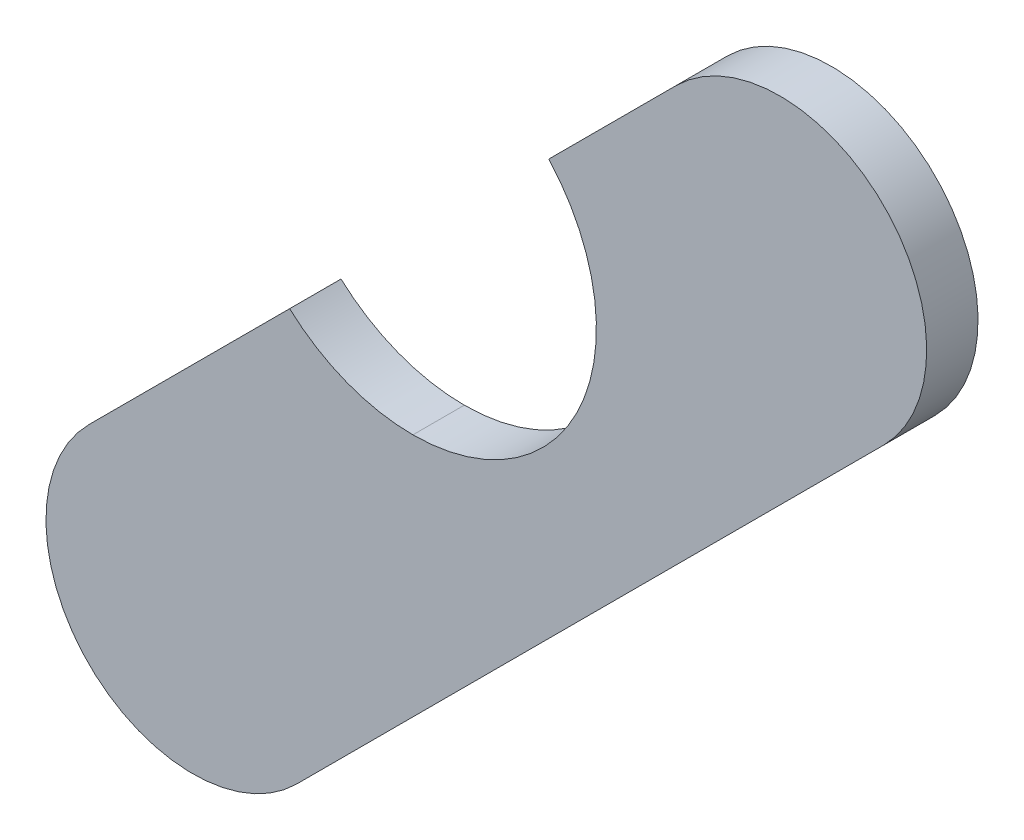
ISO-10303-21;
HEADER;
FILE_DESCRIPTION(('STEP AP214'),'2;1');
FILE_NAME('part.step','',(''),(''),'','','');
FILE_SCHEMA(('AUTOMOTIVE_DESIGN { 1 0 10303 214 1 1 1 1 }'));
ENDSEC;
DATA;
#1=APPLICATION_CONTEXT('core data for automotive mechanical design processes');
#2=APPLICATION_PROTOCOL_DEFINITION('international standard','automotive_design',2000,#1);
#3=PRODUCT_CONTEXT('',#1,'mechanical');
#4=PRODUCT('Part','Part','',(#3));
#5=PRODUCT_RELATED_PRODUCT_CATEGORY('part','',(#4));
#6=PRODUCT_DEFINITION_FORMATION('','',#4);
#7=PRODUCT_DEFINITION_CONTEXT('part definition',#1,'design');
#8=PRODUCT_DEFINITION('design','',#6,#7);
#9=PRODUCT_DEFINITION_SHAPE('','',#8);
#10=(LENGTH_UNIT() NAMED_UNIT(*) SI_UNIT(.MILLI.,.METRE.));
#11=(NAMED_UNIT(*) PLANE_ANGLE_UNIT() SI_UNIT($,.RADIAN.));
#12=(NAMED_UNIT(*) SI_UNIT($,.STERADIAN.) SOLID_ANGLE_UNIT());
#13=UNCERTAINTY_MEASURE_WITH_UNIT(LENGTH_MEASURE(1.E-05),#10,'distance_accuracy_value','');
#14=(GEOMETRIC_REPRESENTATION_CONTEXT(3) GLOBAL_UNCERTAINTY_ASSIGNED_CONTEXT((#13)) GLOBAL_UNIT_ASSIGNED_CONTEXT((#10,
#11,#12)) REPRESENTATION_CONTEXT('',''));
#15=CARTESIAN_POINT('',(0.,0.,0.));
#16=DIRECTION('',(0.,0.,1.));
#17=DIRECTION('',(1.,0.,0.));
#18=AXIS2_PLACEMENT_3D('',#15,#16,#17);
#19=CARTESIAN_POINT('',(82.75,-112.1,-0.045));
#20=DIRECTION('',(0.,0.,-1.));
#21=DIRECTION('',(0.,-1.,0.));
#22=AXIS2_PLACEMENT_3D('',#19,#20,#21);
#23=CYLINDRICAL_SURFACE('',#22,0.125);
#24=CARTESIAN_POINT('',(82.75,-112.1,1.6));
#25=DIRECTION('',(0.,0.,-1.));
#26=DIRECTION('',(0.,-1.,0.));
#27=AXIS2_PLACEMENT_3D('',#24,#25,#26);
#28=CIRCLE('',#27,0.125);
#29=CARTESIAN_POINT('',(82.842573225549,-112.0160047744,1.6));
#30=VERTEX_POINT('',#29);
#31=CARTESIAN_POINT('',(82.75,-112.225,1.6));
#32=VERTEX_POINT('',#31);
#33=EDGE_CURVE('E153',#30,#32,#28,.T.);
#34=ORIENTED_EDGE('',*,*,#33,.T.);
#35=DIRECTION('',(0.,0.,1.));
#36=VECTOR('',#35,1.);
#37=CARTESIAN_POINT('',(82.75,-112.225,-0.045));
#38=LINE('',#37,#36);
#39=CARTESIAN_POINT('',(82.75,-112.225,1.635));
#40=VERTEX_POINT('',#39);
#41=EDGE_CURVE('E11',#32,#40,#38,.T.);
#42=ORIENTED_EDGE('',*,*,#41,.T.);
#43=CARTESIAN_POINT('',(82.75,-112.1,1.635));
#44=DIRECTION('',(0.,0.,-1.));
#45=DIRECTION('',(0.,-1.,0.));
#46=AXIS2_PLACEMENT_3D('',#43,#44,#45);
#47=CIRCLE('',#46,0.125);
#48=CARTESIAN_POINT('',(82.842573225549,-112.0160047744,1.635));
#49=VERTEX_POINT('',#48);
#50=EDGE_CURVE('E139',#49,#40,#47,.T.);
#51=ORIENTED_EDGE('',*,*,#50,.F.);
#52=DIRECTION('',(0.,0.,-1.));
#53=VECTOR('',#52,1.);
#54=CARTESIAN_POINT('',(82.842573225539,-112.0160047744,-0.045));
#55=LINE('',#54,#53);
#56=EDGE_CURVE('E26',#49,#30,#55,.T.);
#57=ORIENTED_EDGE('',*,*,#56,.T.);
#58=EDGE_LOOP('',(#34,#42,#51,#57));
#59=FACE_BOUND('',#58,.T.);
#60=ADVANCED_FACE('F17',(#59),#23,.F.);
#61=CARTESIAN_POINT('',(82.75,-112.1,-0.045));
#62=DIRECTION('',(0.,0.,-1.));
#63=DIRECTION('',(0.,-1.,0.));
#64=AXIS2_PLACEMENT_3D('',#61,#62,#63);
#65=CYLINDRICAL_SURFACE('',#64,0.125);
#66=ORIENTED_EDGE('',*,*,#41,.F.);
#67=CARTESIAN_POINT('',(82.75,-112.1,1.6));
#68=DIRECTION('',(0.,0.,-1.));
#69=DIRECTION('',(0.,-1.,0.));
#70=AXIS2_PLACEMENT_3D('',#67,#68,#69);
#71=CIRCLE('',#70,0.125);
#72=CARTESIAN_POINT('',(82.666004774451,-112.1925732255,1.6));
#73=VERTEX_POINT('',#72);
#74=EDGE_CURVE('E156',#32,#73,#71,.T.);
#75=ORIENTED_EDGE('',*,*,#74,.T.);
#76=DIRECTION('',(0.,0.,-1.));
#77=VECTOR('',#76,1.);
#78=CARTESIAN_POINT('',(82.666004774461,-112.1925732255,-0.045));
#79=LINE('',#78,#77);
#80=CARTESIAN_POINT('',(82.666004774451,-112.1925732255,1.635));
#81=VERTEX_POINT('',#80);
#82=EDGE_CURVE('E38',#81,#73,#79,.T.);
#83=ORIENTED_EDGE('',*,*,#82,.F.);
#84=CARTESIAN_POINT('',(82.75,-112.1,1.635));
#85=DIRECTION('',(0.,0.,-1.));
#86=DIRECTION('',(0.,-1.,0.));
#87=AXIS2_PLACEMENT_3D('',#84,#85,#86);
#88=CIRCLE('',#87,0.125);
#89=EDGE_CURVE('E142',#40,#81,#88,.T.);
#90=ORIENTED_EDGE('',*,*,#89,.F.);
#91=EDGE_LOOP('',(#66,#75,#83,#90));
#92=FACE_BOUND('',#91,.T.);
#93=ADVANCED_FACE('F19',(#92),#65,.F.);
#94=CARTESIAN_POINT('',(82.929289,-111.929289,1.6));
#95=DIRECTION('',(0.707106781186548,-0.707106781186548,0.));
#96=DIRECTION('',(0.,0.,-1.));
#97=AXIS2_PLACEMENT_3D('',#94,#95,#96);
#98=PLANE('',#97);
#99=ORIENTED_EDGE('',*,*,#56,.F.);
#100=DIRECTION('',(-0.707106781186548,-0.707106781186548,0.));
#101=VECTOR('',#100,1.);
#102=CARTESIAN_POINT('',(82.929289,-111.929289,1.635));
#103=LINE('',#102,#101);
#104=CARTESIAN_POINT('',(82.929289,-111.929289,1.635));
#105=VERTEX_POINT('',#104);
#106=EDGE_CURVE('E135',#105,#49,#103,.T.);
#107=ORIENTED_EDGE('',*,*,#106,.F.);
#108=DIRECTION('',(0.,0.,1.));
#109=VECTOR('',#108,1.);
#110=CARTESIAN_POINT('',(82.929289,-111.929289,1.6));
#111=LINE('',#110,#109);
#112=CARTESIAN_POINT('',(82.929289,-111.929289,1.6));
#113=VERTEX_POINT('',#112);
#114=EDGE_CURVE('E144',#113,#105,#111,.T.);
#115=ORIENTED_EDGE('',*,*,#114,.F.);
#116=DIRECTION('',(-0.707106781186548,-0.707106781186548,0.));
#117=VECTOR('',#116,1.);
#118=CARTESIAN_POINT('',(82.929289,-111.929289,1.6));
#119=LINE('',#118,#117);
#120=EDGE_CURVE('E134',#113,#30,#119,.T.);
#121=ORIENTED_EDGE('',*,*,#120,.T.);
#122=EDGE_LOOP('',(#99,#107,#115,#121));
#123=FACE_BOUND('',#122,.T.);
#124=ADVANCED_FACE('F184',(#123),#98,.F.);
#125=CARTESIAN_POINT('',(82.929289,-111.929289,1.6));
#126=DIRECTION('',(0.707106781186548,-0.707106781186548,0.));
#127=DIRECTION('',(0.,0.,-1.));
#128=AXIS2_PLACEMENT_3D('',#125,#126,#127);
#129=PLANE('',#128);
#130=DIRECTION('',(0.,0.,1.));
#131=VECTOR('',#130,1.);
#132=CARTESIAN_POINT('',(82.529289,-112.329289,1.6));
#133=LINE('',#132,#131);
#134=CARTESIAN_POINT('',(82.529289,-112.329289,1.6));
#135=VERTEX_POINT('',#134);
#136=CARTESIAN_POINT('',(82.529289,-112.329289,1.635));
#137=VERTEX_POINT('',#136);
#138=EDGE_CURVE('E104',#135,#137,#133,.T.);
#139=ORIENTED_EDGE('',*,*,#138,.T.);
#140=DIRECTION('',(-0.707106781186548,-0.707106781186548,0.));
#141=VECTOR('',#140,1.);
#142=CARTESIAN_POINT('',(82.929289,-111.929289,1.635));
#143=LINE('',#142,#141);
#144=EDGE_CURVE('E140',#81,#137,#143,.T.);
#145=ORIENTED_EDGE('',*,*,#144,.F.);
#146=ORIENTED_EDGE('',*,*,#82,.T.);
#147=DIRECTION('',(-0.707106781186548,-0.707106781186548,0.));
#148=VECTOR('',#147,1.);
#149=CARTESIAN_POINT('',(82.929289,-111.929289,1.6));
#150=LINE('',#149,#148);
#151=EDGE_CURVE('E162',#73,#135,#150,.T.);
#152=ORIENTED_EDGE('',*,*,#151,.T.);
#153=EDGE_LOOP('',(#139,#145,#146,#152));
#154=FACE_BOUND('',#153,.T.);
#155=ADVANCED_FACE('F207',(#154),#129,.F.);
#156=CARTESIAN_POINT('',(82.67071,-112.47071,1.635));
#157=DIRECTION('',(0.,0.,1.));
#158=DIRECTION('',(1.,0.,0.));
#159=AXIS2_PLACEMENT_3D('',#156,#157,#158);
#160=PLANE('',#159);
#161=CARTESIAN_POINT('',(82.5999995,-112.3999995,1.635));
#162=DIRECTION('',(0.,0.,1.));
#163=DIRECTION('',(-0.707106781186048,0.707106781187048,0.));
#164=AXIS2_PLACEMENT_3D('',#161,#162,#163);
#165=CIRCLE('',#164,0.09999974810218);
#166=CARTESIAN_POINT('',(82.67071,-112.47071,1.635));
#167=VERTEX_POINT('',#166);
#168=EDGE_CURVE('E109',#137,#167,#165,.T.);
#169=ORIENTED_EDGE('',*,*,#168,.T.);
#170=DIRECTION('',(0.707106781186548,0.707106781186548,0.));
#171=VECTOR('',#170,1.);
#172=CARTESIAN_POINT('',(82.67071,-112.47071,1.635));
#173=LINE('',#172,#171);
#174=CARTESIAN_POINT('',(83.07071,-112.07071,1.635));
#175=VERTEX_POINT('',#174);
#176=EDGE_CURVE('E117',#167,#175,#173,.T.);
#177=ORIENTED_EDGE('',*,*,#176,.T.);
#178=CARTESIAN_POINT('',(82.9999995,-111.9999995,1.635));
#179=DIRECTION('',(0.,0.,1.));
#180=DIRECTION('',(0.707106781186548,-0.707106781186548,0.));
#181=AXIS2_PLACEMENT_3D('',#178,#179,#180);
#182=CIRCLE('',#181,0.09999974810219);
#183=EDGE_CURVE('E148',#175,#105,#182,.T.);
#184=ORIENTED_EDGE('',*,*,#183,.T.);
#185=ORIENTED_EDGE('',*,*,#106,.T.);
#186=ORIENTED_EDGE('',*,*,#50,.T.);
#187=ORIENTED_EDGE('',*,*,#89,.T.);
#188=ORIENTED_EDGE('',*,*,#144,.T.);
#189=EDGE_LOOP('',(#169,#177,#184,#185,#186,#187,#188));
#190=FACE_BOUND('',#189,.T.);
#191=ADVANCED_FACE('F187',(#190),#160,.T.);
#192=CARTESIAN_POINT('',(82.67071,-112.47071,1.6));
#193=DIRECTION('',(0.,0.,1.));
#194=DIRECTION('',(1.,0.,0.));
#195=AXIS2_PLACEMENT_3D('',#192,#193,#194);
#196=PLANE('',#195);
#197=ORIENTED_EDGE('',*,*,#151,.F.);
#198=ORIENTED_EDGE('',*,*,#74,.F.);
#199=ORIENTED_EDGE('',*,*,#33,.F.);
#200=ORIENTED_EDGE('',*,*,#120,.F.);
#201=CARTESIAN_POINT('',(82.9999995,-111.9999995,1.6));
#202=DIRECTION('',(0.,0.,1.));
#203=DIRECTION('',(0.707106781186548,-0.707106781186548,0.));
#204=AXIS2_PLACEMENT_3D('',#201,#202,#203);
#205=CIRCLE('',#204,0.09999974810219);
#206=CARTESIAN_POINT('',(83.07071,-112.07071,1.6));
#207=VERTEX_POINT('',#206);
#208=EDGE_CURVE('E122',#207,#113,#205,.T.);
#209=ORIENTED_EDGE('',*,*,#208,.F.);
#210=DIRECTION('',(0.707106781186548,0.707106781186548,0.));
#211=VECTOR('',#210,1.);
#212=CARTESIAN_POINT('',(82.67071,-112.47071,1.6));
#213=LINE('',#212,#211);
#214=CARTESIAN_POINT('',(82.67071,-112.47071,1.6));
#215=VERTEX_POINT('',#214);
#216=EDGE_CURVE('E115',#215,#207,#213,.T.);
#217=ORIENTED_EDGE('',*,*,#216,.F.);
#218=CARTESIAN_POINT('',(82.5999995,-112.3999995,1.6));
#219=DIRECTION('',(0.,0.,1.));
#220=DIRECTION('',(-0.707106781186048,0.707106781187048,0.));
#221=AXIS2_PLACEMENT_3D('',#218,#219,#220);
#222=CIRCLE('',#221,0.09999974810218);
#223=EDGE_CURVE('E97',#135,#215,#222,.T.);
#224=ORIENTED_EDGE('',*,*,#223,.F.);
#225=EDGE_LOOP('',(#197,#198,#199,#200,#209,#217,#224));
#226=FACE_BOUND('',#225,.T.);
#227=ADVANCED_FACE('F120',(#226),#196,.F.);
#228=CARTESIAN_POINT('',(82.9999995,-111.9999995,1.6));
#229=DIRECTION('',(0.,0.,-1.));
#230=DIRECTION('',(0.707106781186548,-0.707106781186548,0.));
#231=AXIS2_PLACEMENT_3D('',#228,#229,#230);
#232=CYLINDRICAL_SURFACE('',#231,0.09999974810219);
#233=ORIENTED_EDGE('',*,*,#208,.T.);
#234=ORIENTED_EDGE('',*,*,#114,.T.);
#235=ORIENTED_EDGE('',*,*,#183,.F.);
#236=DIRECTION('',(0.,0.,1.));
#237=VECTOR('',#236,1.);
#238=CARTESIAN_POINT('',(83.07071,-112.07071,1.6));
#239=LINE('',#238,#237);
#240=EDGE_CURVE('E125',#207,#175,#239,.T.);
#241=ORIENTED_EDGE('',*,*,#240,.F.);
#242=EDGE_LOOP('',(#233,#234,#235,#241));
#243=FACE_BOUND('',#242,.T.);
#244=ADVANCED_FACE('F189',(#243),#232,.T.);
#245=CARTESIAN_POINT('',(82.5999995,-112.3999995,1.6));
#246=DIRECTION('',(0.,0.,-1.));
#247=DIRECTION('',(-0.707106781186048,0.707106781187048,0.));
#248=AXIS2_PLACEMENT_3D('',#245,#246,#247);
#249=CYLINDRICAL_SURFACE('',#248,0.09999974810218);
#250=ORIENTED_EDGE('',*,*,#223,.T.);
#251=DIRECTION('',(0.,0.,1.));
#252=VECTOR('',#251,1.);
#253=CARTESIAN_POINT('',(82.67071,-112.47071,1.6));
#254=LINE('',#253,#252);
#255=EDGE_CURVE('E101',#215,#167,#254,.T.);
#256=ORIENTED_EDGE('',*,*,#255,.T.);
#257=ORIENTED_EDGE('',*,*,#168,.F.);
#258=ORIENTED_EDGE('',*,*,#138,.F.);
#259=EDGE_LOOP('',(#250,#256,#257,#258));
#260=FACE_BOUND('',#259,.T.);
#261=ADVANCED_FACE('F99',(#260),#249,.T.);
#262=CARTESIAN_POINT('',(82.67071,-112.47071,1.6));
#263=DIRECTION('',(-0.707106781186548,0.707106781186548,0.));
#264=DIRECTION('',(0.,0.,1.));
#265=AXIS2_PLACEMENT_3D('',#262,#263,#264);
#266=PLANE('',#265);
#267=ORIENTED_EDGE('',*,*,#216,.T.);
#268=ORIENTED_EDGE('',*,*,#240,.T.);
#269=ORIENTED_EDGE('',*,*,#176,.F.);
#270=ORIENTED_EDGE('',*,*,#255,.F.);
#271=EDGE_LOOP('',(#267,#268,#269,#270));
#272=FACE_BOUND('',#271,.T.);
#273=ADVANCED_FACE('F113',(#272),#266,.F.);
#274=CLOSED_SHELL('',(#60,#93,#124,#155,#191,#227,#244,#261,#273));
#275=MANIFOLD_SOLID_BREP('B1',#274);
#276=ADVANCED_BREP_SHAPE_REPRESENTATION('',(#18,#275),#14);
#277=SHAPE_DEFINITION_REPRESENTATION(#9,#276);
ENDSEC;
END-ISO-10303-21;
